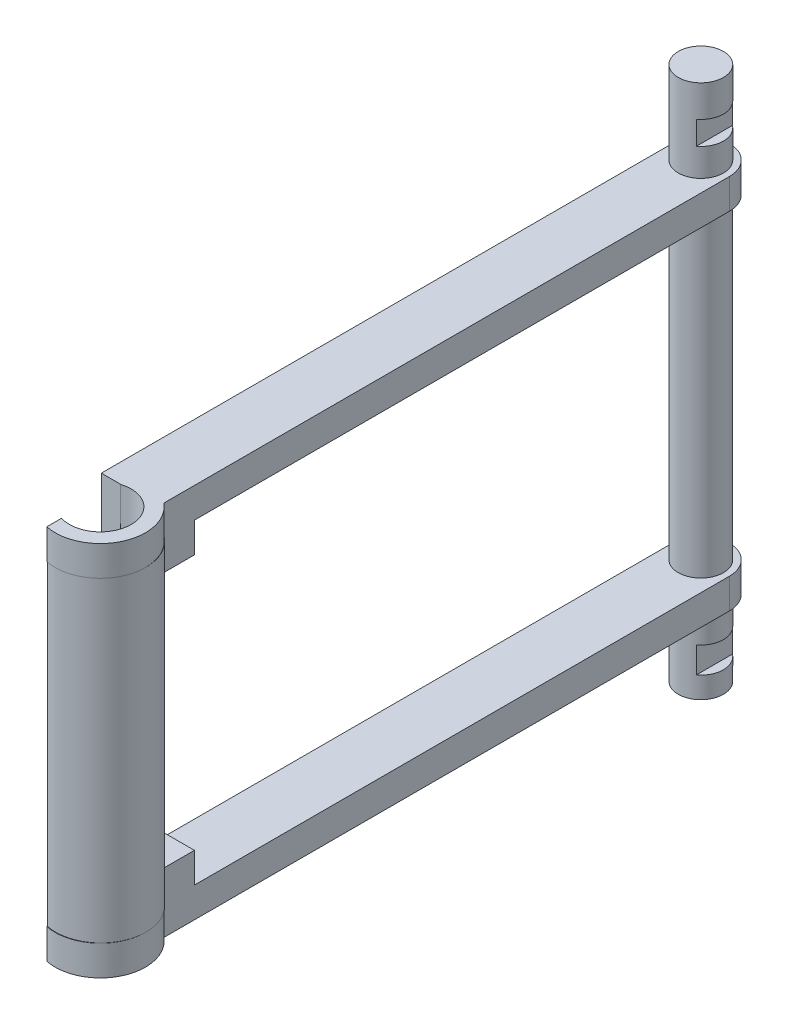
ISO-10303-21;
HEADER;
FILE_DESCRIPTION(('STEP AP214'),'2;1');
FILE_NAME('part.step','',(''),(''),'','','');
FILE_SCHEMA(('AUTOMOTIVE_DESIGN { 1 0 10303 214 1 1 1 1 }'));
ENDSEC;
DATA;
#1=APPLICATION_CONTEXT('core data for automotive mechanical design processes');
#2=APPLICATION_PROTOCOL_DEFINITION('international standard','automotive_design',2000,#1);
#3=PRODUCT_CONTEXT('',#1,'mechanical');
#4=PRODUCT('Part','Part','',(#3));
#5=PRODUCT_RELATED_PRODUCT_CATEGORY('part','',(#4));
#6=PRODUCT_DEFINITION_FORMATION('','',#4);
#7=PRODUCT_DEFINITION_CONTEXT('part definition',#1,'design');
#8=PRODUCT_DEFINITION('design','',#6,#7);
#9=PRODUCT_DEFINITION_SHAPE('','',#8);
#10=(LENGTH_UNIT() NAMED_UNIT(*) SI_UNIT(.MILLI.,.METRE.));
#11=(NAMED_UNIT(*) PLANE_ANGLE_UNIT() SI_UNIT($,.RADIAN.));
#12=(NAMED_UNIT(*) SI_UNIT($,.STERADIAN.) SOLID_ANGLE_UNIT());
#13=UNCERTAINTY_MEASURE_WITH_UNIT(LENGTH_MEASURE(1.E-05),#10,'distance_accuracy_value','');
#14=(GEOMETRIC_REPRESENTATION_CONTEXT(3) GLOBAL_UNCERTAINTY_ASSIGNED_CONTEXT((#13)) GLOBAL_UNIT_ASSIGNED_CONTEXT((#10,
#11,#12)) REPRESENTATION_CONTEXT('',''));
#15=CARTESIAN_POINT('',(0.,0.,0.));
#16=DIRECTION('',(0.,0.,1.));
#17=DIRECTION('',(1.,0.,0.));
#18=AXIS2_PLACEMENT_3D('',#15,#16,#17);
#19=CARTESIAN_POINT('',(0.,30.5,0.));
#20=DIRECTION('',(0.,-1.,0.));
#21=DIRECTION('',(0.,0.,-1.));
#22=AXIS2_PLACEMENT_3D('',#19,#20,#21);
#23=CYLINDRICAL_SURFACE('',#22,1.5);
#24=CARTESIAN_POINT('',(0.,30.5,0.));
#25=DIRECTION('',(0.,1.,0.));
#26=DIRECTION('',(0.,0.,1.));
#27=AXIS2_PLACEMENT_3D('',#24,#25,#26);
#28=CIRCLE('',#27,1.5);
#29=CARTESIAN_POINT('',(0.,30.5,1.5));
#30=VERTEX_POINT('',#29);
#31=EDGE_CURVE('E254',#30,#30,#28,.T.);
#32=ORIENTED_EDGE('',*,*,#31,.F.);
#33=EDGE_LOOP('',(#32));
#34=FACE_BOUND('',#33,.T.);
#35=CARTESIAN_POINT('',(0.,25.,0.));
#36=DIRECTION('',(0.,1.,0.));
#37=DIRECTION('',(0.,0.,1.));
#38=AXIS2_PLACEMENT_3D('',#35,#36,#37);
#39=CIRCLE('',#38,1.5);
#40=CARTESIAN_POINT('',(0.,25.,1.5));
#41=VERTEX_POINT('',#40);
#42=EDGE_CURVE('E258',#41,#41,#39,.F.);
#43=ORIENTED_EDGE('',*,*,#42,.F.);
#44=EDGE_LOOP('',(#43));
#45=FACE_BOUND('',#44,.T.);
#46=DIRECTION('',(0.,-1.,0.));
#47=VECTOR('',#46,1.);
#48=CARTESIAN_POINT('',(0.9,30.5,1.2));
#49=LINE('',#48,#47);
#50=CARTESIAN_POINT('',(0.9,28.3928639786026,1.2));
#51=VERTEX_POINT('',#50);
#52=CARTESIAN_POINT('',(0.9,26.8394891403858,1.2));
#53=VERTEX_POINT('',#52);
#54=EDGE_CURVE('E11',#51,#53,#49,.T.);
#55=ORIENTED_EDGE('',*,*,#54,.F.);
#56=CARTESIAN_POINT('',(0.,28.3928639786026,0.));
#57=DIRECTION('',(0.,1.,0.));
#58=DIRECTION('',(0.,0.,1.));
#59=AXIS2_PLACEMENT_3D('',#56,#57,#58);
#60=CIRCLE('',#59,1.5);
#61=CARTESIAN_POINT('',(0.9,28.3928639786026,-1.2));
#62=VERTEX_POINT('',#61);
#63=EDGE_CURVE('E238',#51,#62,#60,.T.);
#64=ORIENTED_EDGE('',*,*,#63,.T.);
#65=DIRECTION('',(0.,-1.,0.));
#66=VECTOR('',#65,1.);
#67=CARTESIAN_POINT('',(0.9,30.5,-1.2));
#68=LINE('',#67,#66);
#69=CARTESIAN_POINT('',(0.9,26.8394891403858,-1.2));
#70=VERTEX_POINT('',#69);
#71=EDGE_CURVE('E233',#70,#62,#68,.F.);
#72=ORIENTED_EDGE('',*,*,#71,.F.);
#73=CARTESIAN_POINT('',(0.,26.8394891403858,0.));
#74=DIRECTION('',(0.,-1.,0.));
#75=DIRECTION('',(0.,0.,-1.));
#76=AXIS2_PLACEMENT_3D('',#73,#74,#75);
#77=CIRCLE('',#76,1.5);
#78=EDGE_CURVE('E45',#70,#53,#77,.T.);
#79=ORIENTED_EDGE('',*,*,#78,.T.);
#80=EDGE_LOOP('',(#55,#64,#72,#79));
#81=FACE_BOUND('',#80,.T.);
#82=ADVANCED_FACE('F37',(#34,#45,#81),#23,.T.);
#83=CARTESIAN_POINT('',(0.,-5.,0.));
#84=DIRECTION('',(0.,1.,0.));
#85=DIRECTION('',(0.,0.,1.));
#86=AXIS2_PLACEMENT_3D('',#83,#84,#85);
#87=CYLINDRICAL_SURFACE('',#86,1.5);
#88=CARTESIAN_POINT('',(0.,0.,0.));
#89=DIRECTION('',(0.,1.,0.));
#90=DIRECTION('',(0.,0.,1.));
#91=AXIS2_PLACEMENT_3D('',#88,#89,#90);
#92=CIRCLE('',#91,1.5);
#93=CARTESIAN_POINT('',(0.,0.,1.5));
#94=VERTEX_POINT('',#93);
#95=EDGE_CURVE('E223',#94,#94,#92,.F.);
#96=ORIENTED_EDGE('',*,*,#95,.T.);
#97=EDGE_LOOP('',(#96));
#98=FACE_BOUND('',#97,.T.);
#99=CARTESIAN_POINT('',(0.,-5.,0.));
#100=DIRECTION('',(0.,-1.,0.));
#101=DIRECTION('',(0.,0.,-1.));
#102=AXIS2_PLACEMENT_3D('',#99,#100,#101);
#103=CIRCLE('',#102,1.5);
#104=CARTESIAN_POINT('',(0.,-5.,-1.5));
#105=VERTEX_POINT('',#104);
#106=EDGE_CURVE('E228',#105,#105,#103,.T.);
#107=ORIENTED_EDGE('',*,*,#106,.F.);
#108=EDGE_LOOP('',(#107));
#109=FACE_BOUND('',#108,.T.);
#110=DIRECTION('',(0.,1.,0.));
#111=VECTOR('',#110,1.);
#112=CARTESIAN_POINT('',(0.9,-5.,-1.2));
#113=LINE('',#112,#111);
#114=CARTESIAN_POINT('',(0.9,-3.58358721992147,-1.2));
#115=VERTEX_POINT('',#114);
#116=CARTESIAN_POINT('',(0.9,-1.85291950845112,-1.2));
#117=VERTEX_POINT('',#116);
#118=EDGE_CURVE('E231',#115,#117,#113,.T.);
#119=ORIENTED_EDGE('',*,*,#118,.F.);
#120=CARTESIAN_POINT('',(0.,-3.58358721992147,0.));
#121=DIRECTION('',(0.,-1.,0.));
#122=DIRECTION('',(0.,0.,-1.));
#123=AXIS2_PLACEMENT_3D('',#120,#121,#122);
#124=CIRCLE('',#123,1.5);
#125=CARTESIAN_POINT('',(0.9,-3.58358721992147,1.2));
#126=VERTEX_POINT('',#125);
#127=EDGE_CURVE('E227',#115,#126,#124,.T.);
#128=ORIENTED_EDGE('',*,*,#127,.T.);
#129=DIRECTION('',(0.,1.,0.));
#130=VECTOR('',#129,1.);
#131=CARTESIAN_POINT('',(0.9,-5.,1.2));
#132=LINE('',#131,#130);
#133=CARTESIAN_POINT('',(0.9,-1.85291950845112,1.2));
#134=VERTEX_POINT('',#133);
#135=EDGE_CURVE('E214',#134,#126,#132,.F.);
#136=ORIENTED_EDGE('',*,*,#135,.F.);
#137=CARTESIAN_POINT('',(0.,-1.85291950845112,0.));
#138=DIRECTION('',(0.,1.,0.));
#139=DIRECTION('',(0.,0.,1.));
#140=AXIS2_PLACEMENT_3D('',#137,#138,#139);
#141=CIRCLE('',#140,1.5);
#142=EDGE_CURVE('E222',#134,#117,#141,.T.);
#143=ORIENTED_EDGE('',*,*,#142,.T.);
#144=EDGE_LOOP('',(#119,#128,#136,#143));
#145=FACE_BOUND('',#144,.T.);
#146=ADVANCED_FACE('F230',(#98,#109,#145),#87,.T.);
#147=CARTESIAN_POINT('',(-1.9,21.,0.));
#148=DIRECTION('',(-1.,0.,0.));
#149=DIRECTION('',(0.,0.,1.));
#150=AXIS2_PLACEMENT_3D('',#147,#148,#149);
#151=PLANE('',#150);
#152=DIRECTION('',(0.,0.,1.));
#153=VECTOR('',#152,1.);
#154=CARTESIAN_POINT('',(-1.9,21.,0.));
#155=LINE('',#154,#153);
#156=CARTESIAN_POINT('',(-1.9,21.,35.5503543635308));
#157=VERTEX_POINT('',#156);
#158=CARTESIAN_POINT('',(-1.9,21.,37.9374599075044));
#159=VERTEX_POINT('',#158);
#160=EDGE_CURVE('E346',#157,#159,#155,.T.);
#161=ORIENTED_EDGE('',*,*,#160,.T.);
#162=DIRECTION('',(0.,1.,0.));
#163=VECTOR('',#162,1.);
#164=CARTESIAN_POINT('',(-1.9,25.,37.9374599075044));
#165=LINE('',#164,#163);
#166=CARTESIAN_POINT('',(-1.9,25.,37.9374599075044));
#167=VERTEX_POINT('',#166);
#168=EDGE_CURVE('E267',#159,#167,#165,.T.);
#169=ORIENTED_EDGE('',*,*,#168,.T.);
#170=DIRECTION('',(0.,0.,-1.));
#171=VECTOR('',#170,1.);
#172=CARTESIAN_POINT('',(-1.9,25.,37.9374599075044));
#173=LINE('',#172,#171);
#174=CARTESIAN_POINT('',(-1.9,25.,0.));
#175=VERTEX_POINT('',#174);
#176=EDGE_CURVE('E326',#167,#175,#173,.T.);
#177=ORIENTED_EDGE('',*,*,#176,.T.);
#178=DIRECTION('',(0.,1.,0.));
#179=VECTOR('',#178,1.);
#180=CARTESIAN_POINT('',(-1.9,23.,0.));
#181=LINE('',#180,#179);
#182=CARTESIAN_POINT('',(-1.9,23.,0.));
#183=VERTEX_POINT('',#182);
#184=EDGE_CURVE('E315',#183,#175,#181,.T.);
#185=ORIENTED_EDGE('',*,*,#184,.F.);
#186=DIRECTION('',(0.,0.,1.));
#187=VECTOR('',#186,1.);
#188=CARTESIAN_POINT('',(-1.9,23.,0.));
#189=LINE('',#188,#187);
#190=CARTESIAN_POINT('',(-1.9,23.,35.5503543635308));
#191=VERTEX_POINT('',#190);
#192=EDGE_CURVE('E312',#183,#191,#189,.T.);
#193=ORIENTED_EDGE('',*,*,#192,.T.);
#194=DIRECTION('',(0.,1.,0.));
#195=VECTOR('',#194,1.);
#196=CARTESIAN_POINT('',(-1.9,21.,35.5503543635308));
#197=LINE('',#196,#195);
#198=EDGE_CURVE('E348',#157,#191,#197,.T.);
#199=ORIENTED_EDGE('',*,*,#198,.F.);
#200=EDGE_LOOP('',(#161,#169,#177,#185,#193,#199));
#201=FACE_BOUND('',#200,.T.);
#202=ADVANCED_FACE('F537',(#201),#151,.T.);
#203=CARTESIAN_POINT('',(0.,25.,39.903679127832));
#204=DIRECTION('',(0.,1.,0.));
#205=DIRECTION('',(0.,0.,-1.));
#206=AXIS2_PLACEMENT_3D('',#203,#204,#205);
#207=PLANE('',#206);
#208=ORIENTED_EDGE('',*,*,#42,.T.);
#209=EDGE_LOOP('',(#208));
#210=FACE_BOUND('',#209,.T.);
#211=CARTESIAN_POINT('',(0.,25.,39.903679127832));
#212=DIRECTION('',(0.,-1.,0.));
#213=DIRECTION('',(0.,0.,-1.));
#214=AXIS2_PLACEMENT_3D('',#211,#212,#213);
#215=CIRCLE('',#214,2.05);
#216=CARTESIAN_POINT('',(-0.623316180081989,25.,37.9507385399881));
#217=VERTEX_POINT('',#216);
#218=CARTESIAN_POINT('',(-0.623316180081989,25.,41.8566197156759));
#219=VERTEX_POINT('',#218);
#220=EDGE_CURVE('E328',#217,#219,#215,.T.);
#221=ORIENTED_EDGE('',*,*,#220,.T.);
#222=DIRECTION('',(0.,0.,-1.));
#223=VECTOR('',#222,1.);
#224=CARTESIAN_POINT('',(-0.623316180081989,25.,36.9374599075044));
#225=LINE('',#224,#223);
#226=CARTESIAN_POINT('',(-0.623316180081989,25.,42.8382109371072));
#227=VERTEX_POINT('',#226);
#228=EDGE_CURVE('E278',#227,#219,#225,.T.);
#229=ORIENTED_EDGE('',*,*,#228,.F.);
#230=CARTESIAN_POINT('',(0.,25.,39.903679127832));
#231=DIRECTION('',(0.,-1.,0.));
#232=DIRECTION('',(0.,0.,-1.));
#233=AXIS2_PLACEMENT_3D('',#230,#231,#232);
#234=CIRCLE('',#233,3.);
#235=CARTESIAN_POINT('',(1.9,25.,37.5820417745832));
#236=VERTEX_POINT('',#235);
#237=EDGE_CURVE('E332',#236,#227,#234,.T.);
#238=ORIENTED_EDGE('',*,*,#237,.F.);
#239=DIRECTION('',(0.,0.,-1.));
#240=VECTOR('',#239,1.);
#241=CARTESIAN_POINT('',(1.9,25.,0.));
#242=LINE('',#241,#240);
#243=CARTESIAN_POINT('',(1.9,25.,0.));
#244=VERTEX_POINT('',#243);
#245=EDGE_CURVE('E309',#236,#244,#242,.T.);
#246=ORIENTED_EDGE('',*,*,#245,.T.);
#247=CARTESIAN_POINT('',(0.,25.,0.));
#248=DIRECTION('',(0.,1.,0.));
#249=DIRECTION('',(0.,0.,1.));
#250=AXIS2_PLACEMENT_3D('',#247,#248,#249);
#251=CIRCLE('',#250,1.9);
#252=EDGE_CURVE('E304',#244,#175,#251,.T.);
#253=ORIENTED_EDGE('',*,*,#252,.T.);
#254=ORIENTED_EDGE('',*,*,#176,.F.);
#255=DIRECTION('',(1.,0.,0.));
#256=VECTOR('',#255,1.);
#257=CARTESIAN_POINT('',(-0.623316180081989,25.,37.9374599075044));
#258=LINE('',#257,#256);
#259=CARTESIAN_POINT('',(-0.623316180081989,25.,37.9374599075044));
#260=VERTEX_POINT('',#259);
#261=EDGE_CURVE('E264',#167,#260,#258,.T.);
#262=ORIENTED_EDGE('',*,*,#261,.T.);
#263=EDGE_CURVE('E275',#217,#260,#225,.T.);
#264=ORIENTED_EDGE('',*,*,#263,.F.);
#265=EDGE_LOOP('',(#221,#229,#238,#246,#253,#254,#262,#264));
#266=FACE_BOUND('',#265,.T.);
#267=ADVANCED_FACE('F490',(#210,#266),#207,.T.);
#268=CARTESIAN_POINT('',(0.,12.5,39.8719917167796));
#269=DIRECTION('',(0.,-1.,0.));
#270=DIRECTION('',(0.,0.,-1.));
#271=AXIS2_PLACEMENT_3D('',#268,#269,#270);
#272=CYLINDRICAL_SURFACE('',#271,3.);
#273=CARTESIAN_POINT('',(0.,23.,39.8719917167796));
#274=DIRECTION('',(0.,1.,0.));
#275=DIRECTION('',(0.,0.,1.));
#276=AXIS2_PLACEMENT_3D('',#273,#274,#275);
#277=CIRCLE('',#276,3.);
#278=CARTESIAN_POINT('',(-0.623316180081989,23.,42.8065235260548));
#279=VERTEX_POINT('',#278);
#280=CARTESIAN_POINT('',(2.99995816254081,23.,39.8878354223058));
#281=VERTEX_POINT('',#280);
#282=EDGE_CURVE('E360',#279,#281,#277,.T.);
#283=ORIENTED_EDGE('',*,*,#282,.F.);
#284=DIRECTION('',(0.,-1.,0.));
#285=VECTOR('',#284,1.);
#286=CARTESIAN_POINT('',(-0.623316180081989,12.5,42.8065235260548));
#287=LINE('',#286,#285);
#288=CARTESIAN_POINT('',(-0.623316180081989,2.,42.8065235260548));
#289=VERTEX_POINT('',#288);
#290=EDGE_CURVE('E368',#279,#289,#287,.T.);
#291=ORIENTED_EDGE('',*,*,#290,.T.);
#292=CARTESIAN_POINT('',(0.,2.,39.8719917167796));
#293=DIRECTION('',(0.,-1.,0.));
#294=DIRECTION('',(0.,0.,-1.));
#295=AXIS2_PLACEMENT_3D('',#292,#293,#294);
#296=CIRCLE('',#295,3.);
#297=CARTESIAN_POINT('',(2.99995816254081,2.,39.8878354223058));
#298=VERTEX_POINT('',#297);
#299=EDGE_CURVE('E378',#298,#289,#296,.T.);
#300=ORIENTED_EDGE('',*,*,#299,.F.);
#301=CARTESIAN_POINT('',(0.,2.,39.8719917167796));
#302=DIRECTION('',(0.,1.,0.));
#303=DIRECTION('',(0.,0.,1.));
#304=AXIS2_PLACEMENT_3D('',#301,#302,#303);
#305=CIRCLE('',#304,3.);
#306=CARTESIAN_POINT('',(1.9,2.,37.5503543635308));
#307=VERTEX_POINT('',#306);
#308=EDGE_CURVE('E409',#298,#307,#305,.T.);
#309=ORIENTED_EDGE('',*,*,#308,.T.);
#310=DIRECTION('',(0.,-1.,0.));
#311=VECTOR('',#310,1.);
#312=CARTESIAN_POINT('',(1.9,4.,37.5503543635308));
#313=LINE('',#312,#311);
#314=CARTESIAN_POINT('',(1.9,4.,37.5503543635308));
#315=VERTEX_POINT('',#314);
#316=EDGE_CURVE('E401',#315,#307,#313,.T.);
#317=ORIENTED_EDGE('',*,*,#316,.F.);
#318=CARTESIAN_POINT('',(0.,4.,39.8719917167796));
#319=DIRECTION('',(0.,1.,0.));
#320=DIRECTION('',(0.,0.,1.));
#321=AXIS2_PLACEMENT_3D('',#318,#319,#320);
#322=CIRCLE('',#321,3.);
#323=CARTESIAN_POINT('',(-0.623316180081989,4.,36.9374599075044));
#324=VERTEX_POINT('',#323);
#325=EDGE_CURVE('E393',#324,#315,#322,.F.);
#326=ORIENTED_EDGE('',*,*,#325,.F.);
#327=DIRECTION('',(0.,1.,0.));
#328=VECTOR('',#327,1.);
#329=CARTESIAN_POINT('',(-0.623316180081989,0.,36.9374599075044));
#330=LINE('',#329,#328);
#331=CARTESIAN_POINT('',(-0.623316180081989,21.,36.9374599075044));
#332=VERTEX_POINT('',#331);
#333=EDGE_CURVE('E365',#324,#332,#330,.T.);
#334=ORIENTED_EDGE('',*,*,#333,.T.);
#335=CARTESIAN_POINT('',(0.,21.,39.8719917167796));
#336=DIRECTION('',(0.,1.,0.));
#337=DIRECTION('',(0.,0.,1.));
#338=AXIS2_PLACEMENT_3D('',#335,#336,#337);
#339=CIRCLE('',#338,3.);
#340=CARTESIAN_POINT('',(1.9,21.,37.5503543635308));
#341=VERTEX_POINT('',#340);
#342=EDGE_CURVE('E344',#332,#341,#339,.F.);
#343=ORIENTED_EDGE('',*,*,#342,.T.);
#344=DIRECTION('',(0.,1.,0.));
#345=VECTOR('',#344,1.);
#346=CARTESIAN_POINT('',(1.9,21.,37.5503543635308));
#347=LINE('',#346,#345);
#348=CARTESIAN_POINT('',(1.9,23.,37.5503543635308));
#349=VERTEX_POINT('',#348);
#350=EDGE_CURVE('E353',#341,#349,#347,.T.);
#351=ORIENTED_EDGE('',*,*,#350,.T.);
#352=EDGE_CURVE('E359',#281,#349,#277,.T.);
#353=ORIENTED_EDGE('',*,*,#352,.F.);
#354=EDGE_LOOP('',(#283,#291,#300,#309,#317,#326,#334,#343,#351,#353));
#355=FACE_BOUND('',#354,.T.);
#356=ADVANCED_FACE('F467',(#355),#272,.T.);
#357=CARTESIAN_POINT('',(0.,0.,39.903679127832));
#358=DIRECTION('',(0.,1.,0.));
#359=DIRECTION('',(0.,0.,1.));
#360=AXIS2_PLACEMENT_3D('',#357,#358,#359);
#361=CYLINDRICAL_SURFACE('',#360,2.05);
#362=DIRECTION('',(0.,1.,0.));
#363=VECTOR('',#362,1.);
#364=CARTESIAN_POINT('',(-0.623316180081989,0.,41.8566197156759));
#365=LINE('',#364,#363);
#366=CARTESIAN_POINT('',(-0.623316180081989,0.,41.8566197156759));
#367=VERTEX_POINT('',#366);
#368=EDGE_CURVE('E370',#367,#219,#365,.T.);
#369=ORIENTED_EDGE('',*,*,#368,.T.);
#370=ORIENTED_EDGE('',*,*,#220,.F.);
#371=DIRECTION('',(0.,1.,0.));
#372=VECTOR('',#371,1.);
#373=CARTESIAN_POINT('',(-0.623316180081989,0.,37.9507385399881));
#374=LINE('',#373,#372);
#375=CARTESIAN_POINT('',(-0.623316180081989,0.,37.9507385399881));
#376=VERTEX_POINT('',#375);
#377=EDGE_CURVE('E372',#217,#376,#374,.F.);
#378=ORIENTED_EDGE('',*,*,#377,.T.);
#379=CARTESIAN_POINT('',(0.,0.,39.903679127832));
#380=DIRECTION('',(0.,1.,0.));
#381=DIRECTION('',(0.,0.,1.));
#382=AXIS2_PLACEMENT_3D('',#379,#380,#381);
#383=CIRCLE('',#382,2.05);
#384=EDGE_CURVE('E406',#367,#376,#383,.T.);
#385=ORIENTED_EDGE('',*,*,#384,.F.);
#386=EDGE_LOOP('',(#369,#370,#378,#385));
#387=FACE_BOUND('',#386,.T.);
#388=ADVANCED_FACE('F495',(#387),#361,.F.);
#389=CARTESIAN_POINT('',(0.,21.,0.));
#390=DIRECTION('',(0.,-1.,0.));
#391=DIRECTION('',(0.,0.,1.));
#392=AXIS2_PLACEMENT_3D('',#389,#390,#391);
#393=PLANE('',#392);
#394=ORIENTED_EDGE('',*,*,#342,.F.);
#395=DIRECTION('',(0.,0.,-1.));
#396=VECTOR('',#395,1.);
#397=CARTESIAN_POINT('',(-0.623316180081989,21.,37.9374599075044));
#398=LINE('',#397,#396);
#399=CARTESIAN_POINT('',(-0.623316180081989,21.,37.9374599075044));
#400=VERTEX_POINT('',#399);
#401=EDGE_CURVE('E273',#400,#332,#398,.T.);
#402=ORIENTED_EDGE('',*,*,#401,.F.);
#403=DIRECTION('',(-1.,0.,0.));
#404=VECTOR('',#403,1.);
#405=CARTESIAN_POINT('',(-0.623316180081989,21.,37.9374599075044));
#406=LINE('',#405,#404);
#407=EDGE_CURVE('E270',#400,#159,#406,.T.);
#408=ORIENTED_EDGE('',*,*,#407,.T.);
#409=ORIENTED_EDGE('',*,*,#160,.F.);
#410=DIRECTION('',(1.,0.,0.));
#411=VECTOR('',#410,1.);
#412=CARTESIAN_POINT('',(0.,21.,35.5503543635308));
#413=LINE('',#412,#411);
#414=CARTESIAN_POINT('',(1.9,21.,35.5503543635308));
#415=VERTEX_POINT('',#414);
#416=EDGE_CURVE('E339',#157,#415,#413,.T.);
#417=ORIENTED_EDGE('',*,*,#416,.T.);
#418=DIRECTION('',(0.,0.,-1.));
#419=VECTOR('',#418,1.);
#420=CARTESIAN_POINT('',(1.9,21.,0.));
#421=LINE('',#420,#419);
#422=EDGE_CURVE('E341',#341,#415,#421,.T.);
#423=ORIENTED_EDGE('',*,*,#422,.F.);
#424=EDGE_LOOP('',(#394,#402,#408,#409,#417,#423));
#425=FACE_BOUND('',#424,.T.);
#426=ADVANCED_FACE('F563',(#425),#393,.T.);
#427=CARTESIAN_POINT('',(0.,23.,39.903679127832));
#428=DIRECTION('',(0.,1.,0.));
#429=DIRECTION('',(0.,0.,-1.));
#430=AXIS2_PLACEMENT_3D('',#427,#428,#429);
#431=PLANE('',#430);
#432=DIRECTION('',(0.,0.,1.));
#433=VECTOR('',#432,1.);
#434=CARTESIAN_POINT('',(-0.623316180081989,23.,39.903679127832));
#435=LINE('',#434,#433);
#436=CARTESIAN_POINT('',(-0.623316180081989,23.,42.8382109371072));
#437=VERTEX_POINT('',#436);
#438=EDGE_CURVE('E279',#279,#437,#435,.T.);
#439=ORIENTED_EDGE('',*,*,#438,.F.);
#440=ORIENTED_EDGE('',*,*,#282,.T.);
#441=CARTESIAN_POINT('',(0.,23.,39.903679127832));
#442=DIRECTION('',(0.,-1.,0.));
#443=DIRECTION('',(0.,0.,-1.));
#444=AXIS2_PLACEMENT_3D('',#441,#442,#443);
#445=CIRCLE('',#444,3.);
#446=EDGE_CURVE('E331',#281,#437,#445,.T.);
#447=ORIENTED_EDGE('',*,*,#446,.T.);
#448=EDGE_LOOP('',(#439,#440,#447));
#449=FACE_BOUND('',#448,.T.);
#450=ADVANCED_FACE('F472',(#449),#431,.F.);
#451=CARTESIAN_POINT('',(0.,25.,39.903679127832));
#452=DIRECTION('',(0.,-1.,0.));
#453=DIRECTION('',(0.,0.,-1.));
#454=AXIS2_PLACEMENT_3D('',#451,#452,#453);
#455=CYLINDRICAL_SURFACE('',#454,3.);
#456=ORIENTED_EDGE('',*,*,#237,.T.);
#457=DIRECTION('',(0.,-1.,0.));
#458=VECTOR('',#457,1.);
#459=CARTESIAN_POINT('',(-0.623316180081989,25.,42.8382109371072));
#460=LINE('',#459,#458);
#461=EDGE_CURVE('E434',#227,#437,#460,.T.);
#462=ORIENTED_EDGE('',*,*,#461,.T.);
#463=ORIENTED_EDGE('',*,*,#446,.F.);
#464=CARTESIAN_POINT('',(1.9,23.,37.5820417745832));
#465=VERTEX_POINT('',#464);
#466=EDGE_CURVE('E338',#465,#281,#445,.T.);
#467=ORIENTED_EDGE('',*,*,#466,.F.);
#468=DIRECTION('',(0.,-1.,0.));
#469=VECTOR('',#468,1.);
#470=CARTESIAN_POINT('',(1.9,25.,37.5820417745832));
#471=LINE('',#470,#469);
#472=EDGE_CURVE('E324',#236,#465,#471,.T.);
#473=ORIENTED_EDGE('',*,*,#472,.F.);
#474=EDGE_LOOP('',(#456,#462,#463,#467,#473));
#475=FACE_BOUND('',#474,.T.);
#476=ADVANCED_FACE('F477',(#475),#455,.T.);
#477=CARTESIAN_POINT('',(-0.623316180081989,0.,36.9374599075044));
#478=DIRECTION('',(1.,0.,0.));
#479=DIRECTION('',(0.,0.,-1.));
#480=AXIS2_PLACEMENT_3D('',#477,#478,#479);
#481=PLANE('',#480);
#482=DIRECTION('',(0.,-1.,0.));
#483=VECTOR('',#482,1.);
#484=CARTESIAN_POINT('',(-0.623316180081989,25.,37.9374599075044));
#485=LINE('',#484,#483);
#486=EDGE_CURVE('E261',#260,#400,#485,.T.);
#487=ORIENTED_EDGE('',*,*,#486,.T.);
#488=ORIENTED_EDGE('',*,*,#401,.T.);
#489=ORIENTED_EDGE('',*,*,#333,.F.);
#490=DIRECTION('',(0.,0.,-1.));
#491=VECTOR('',#490,1.);
#492=CARTESIAN_POINT('',(-0.623316180081989,4.,37.9374599075044));
#493=LINE('',#492,#491);
#494=CARTESIAN_POINT('',(-0.623316180081989,4.,37.9374599075044));
#495=VERTEX_POINT('',#494);
#496=EDGE_CURVE('E292',#495,#324,#493,.T.);
#497=ORIENTED_EDGE('',*,*,#496,.F.);
#498=DIRECTION('',(0.,1.,0.));
#499=VECTOR('',#498,1.);
#500=CARTESIAN_POINT('',(-0.623316180081989,0.,37.9374599075044));
#501=LINE('',#500,#499);
#502=CARTESIAN_POINT('',(-0.623316180081989,0.,37.9374599075044));
#503=VERTEX_POINT('',#502);
#504=EDGE_CURVE('E281',#503,#495,#501,.T.);
#505=ORIENTED_EDGE('',*,*,#504,.F.);
#506=DIRECTION('',(0.,0.,-1.));
#507=VECTOR('',#506,1.);
#508=CARTESIAN_POINT('',(-0.623316180081989,0.,36.9374599075044));
#509=LINE('',#508,#507);
#510=EDGE_CURVE('E294',#376,#503,#509,.T.);
#511=ORIENTED_EDGE('',*,*,#510,.F.);
#512=ORIENTED_EDGE('',*,*,#377,.F.);
#513=ORIENTED_EDGE('',*,*,#263,.T.);
#514=EDGE_LOOP('',(#487,#488,#489,#497,#505,#511,#512,#513));
#515=FACE_BOUND('',#514,.T.);
#516=ADVANCED_FACE('F500',(#515),#481,.F.);
#517=CARTESIAN_POINT('',(-1.9,2.,0.));
#518=DIRECTION('',(1.,0.,0.));
#519=DIRECTION('',(0.,0.,-1.));
#520=AXIS2_PLACEMENT_3D('',#517,#518,#519);
#521=PLANE('',#520);
#522=DIRECTION('',(0.,0.,1.));
#523=VECTOR('',#522,1.);
#524=CARTESIAN_POINT('',(-1.9,0.,0.));
#525=LINE('',#524,#523);
#526=CARTESIAN_POINT('',(-1.9,0.,0.));
#527=VERTEX_POINT('',#526);
#528=CARTESIAN_POINT('',(-1.9,0.,37.9374599075044));
#529=VERTEX_POINT('',#528);
#530=EDGE_CURVE('E426',#527,#529,#525,.T.);
#531=ORIENTED_EDGE('',*,*,#530,.T.);
#532=DIRECTION('',(0.,-1.,0.));
#533=VECTOR('',#532,1.);
#534=CARTESIAN_POINT('',(-1.9,0.,37.9374599075044));
#535=LINE('',#534,#533);
#536=CARTESIAN_POINT('',(-1.9,4.,37.9374599075044));
#537=VERTEX_POINT('',#536);
#538=EDGE_CURVE('E287',#537,#529,#535,.T.);
#539=ORIENTED_EDGE('',*,*,#538,.F.);
#540=DIRECTION('',(0.,0.,1.));
#541=VECTOR('',#540,1.);
#542=CARTESIAN_POINT('',(-1.9,4.,0.));
#543=LINE('',#542,#541);
#544=CARTESIAN_POINT('',(-1.9,4.,35.5503543635308));
#545=VERTEX_POINT('',#544);
#546=EDGE_CURVE('E391',#545,#537,#543,.T.);
#547=ORIENTED_EDGE('',*,*,#546,.F.);
#548=DIRECTION('',(0.,-1.,0.));
#549=VECTOR('',#548,1.);
#550=CARTESIAN_POINT('',(-1.9,4.,35.5503543635308));
#551=LINE('',#550,#549);
#552=CARTESIAN_POINT('',(-1.9,2.,35.5503543635308));
#553=VERTEX_POINT('',#552);
#554=EDGE_CURVE('E404',#545,#553,#551,.T.);
#555=ORIENTED_EDGE('',*,*,#554,.T.);
#556=DIRECTION('',(0.,0.,1.));
#557=VECTOR('',#556,1.);
#558=CARTESIAN_POINT('',(-1.9,2.,0.));
#559=LINE('',#558,#557);
#560=CARTESIAN_POINT('',(-1.9,2.,0.));
#561=VERTEX_POINT('',#560);
#562=EDGE_CURVE('E415',#561,#553,#559,.T.);
#563=ORIENTED_EDGE('',*,*,#562,.F.);
#564=DIRECTION('',(0.,-1.,0.));
#565=VECTOR('',#564,1.);
#566=CARTESIAN_POINT('',(-1.9,2.,0.));
#567=LINE('',#566,#565);
#568=EDGE_CURVE('E431',#561,#527,#567,.T.);
#569=ORIENTED_EDGE('',*,*,#568,.T.);
#570=EDGE_LOOP('',(#531,#539,#547,#555,#563,#569));
#571=FACE_BOUND('',#570,.T.);
#572=ADVANCED_FACE('F508',(#571),#521,.F.);
#573=CARTESIAN_POINT('',(0.,4.,0.));
#574=DIRECTION('',(0.,1.,0.));
#575=DIRECTION('',(0.,0.,1.));
#576=AXIS2_PLACEMENT_3D('',#573,#574,#575);
#577=PLANE('',#576);
#578=ORIENTED_EDGE('',*,*,#546,.T.);
#579=DIRECTION('',(-1.,0.,0.));
#580=VECTOR('',#579,1.);
#581=CARTESIAN_POINT('',(-0.623316180081989,4.,37.9374599075044));
#582=LINE('',#581,#580);
#583=EDGE_CURVE('E284',#495,#537,#582,.T.);
#584=ORIENTED_EDGE('',*,*,#583,.F.);
#585=ORIENTED_EDGE('',*,*,#496,.T.);
#586=ORIENTED_EDGE('',*,*,#325,.T.);
#587=DIRECTION('',(0.,0.,-1.));
#588=VECTOR('',#587,1.);
#589=CARTESIAN_POINT('',(1.9,4.,0.));
#590=LINE('',#589,#588);
#591=CARTESIAN_POINT('',(1.9,4.,35.5503543635308));
#592=VERTEX_POINT('',#591);
#593=EDGE_CURVE('E395',#315,#592,#590,.T.);
#594=ORIENTED_EDGE('',*,*,#593,.T.);
#595=DIRECTION('',(1.,0.,0.));
#596=VECTOR('',#595,1.);
#597=CARTESIAN_POINT('',(0.,4.,35.5503543635308));
#598=LINE('',#597,#596);
#599=EDGE_CURVE('E388',#545,#592,#598,.T.);
#600=ORIENTED_EDGE('',*,*,#599,.F.);
#601=EDGE_LOOP('',(#578,#584,#585,#586,#594,#600));
#602=FACE_BOUND('',#601,.T.);
#603=ADVANCED_FACE('F581',(#602),#577,.T.);
#604=CARTESIAN_POINT('',(0.,23.,39.8719917167796));
#605=DIRECTION('',(0.,-1.,0.));
#606=DIRECTION('',(0.,0.,1.));
#607=AXIS2_PLACEMENT_3D('',#604,#605,#606);
#608=PLANE('',#607);
#609=ORIENTED_EDGE('',*,*,#352,.T.);
#610=DIRECTION('',(0.,0.,-1.));
#611=VECTOR('',#610,1.);
#612=CARTESIAN_POINT('',(1.9,23.,0.));
#613=LINE('',#612,#611);
#614=EDGE_CURVE('E311',#465,#349,#613,.T.);
#615=ORIENTED_EDGE('',*,*,#614,.F.);
#616=ORIENTED_EDGE('',*,*,#466,.T.);
#617=EDGE_LOOP('',(#609,#615,#616));
#618=FACE_BOUND('',#617,.T.);
#619=ADVANCED_FACE('F483',(#618),#608,.F.);
#620=CARTESIAN_POINT('',(1.9,2.,0.));
#621=DIRECTION('',(-1.,0.,0.));
#622=DIRECTION('',(0.,0.,1.));
#623=AXIS2_PLACEMENT_3D('',#620,#621,#622);
#624=PLANE('',#623);
#625=ORIENTED_EDGE('',*,*,#316,.T.);
#626=DIRECTION('',(0.,0.,-1.));
#627=VECTOR('',#626,1.);
#628=CARTESIAN_POINT('',(1.9,2.,0.));
#629=LINE('',#628,#627);
#630=CARTESIAN_POINT('',(1.9,2.,37.5820417745832));
#631=VERTEX_POINT('',#630);
#632=EDGE_CURVE('E420',#631,#307,#629,.T.);
#633=ORIENTED_EDGE('',*,*,#632,.F.);
#634=DIRECTION('',(0.,1.,0.));
#635=VECTOR('',#634,1.);
#636=CARTESIAN_POINT('',(1.9,0.,37.5820417745832));
#637=LINE('',#636,#635);
#638=CARTESIAN_POINT('',(1.9,0.,37.5820417745832));
#639=VERTEX_POINT('',#638);
#640=EDGE_CURVE('E384',#639,#631,#637,.T.);
#641=ORIENTED_EDGE('',*,*,#640,.F.);
#642=DIRECTION('',(0.,0.,-1.));
#643=VECTOR('',#642,1.);
#644=CARTESIAN_POINT('',(1.9,0.,0.));
#645=LINE('',#644,#643);
#646=CARTESIAN_POINT('',(1.9,0.,0.));
#647=VERTEX_POINT('',#646);
#648=EDGE_CURVE('E416',#639,#647,#645,.T.);
#649=ORIENTED_EDGE('',*,*,#648,.T.);
#650=DIRECTION('',(0.,-1.,0.));
#651=VECTOR('',#650,1.);
#652=CARTESIAN_POINT('',(1.9,2.,0.));
#653=LINE('',#652,#651);
#654=CARTESIAN_POINT('',(1.9,2.,0.));
#655=VERTEX_POINT('',#654);
#656=EDGE_CURVE('E423',#655,#647,#653,.T.);
#657=ORIENTED_EDGE('',*,*,#656,.F.);
#658=CARTESIAN_POINT('',(1.9,2.,35.5503543635308));
#659=VERTEX_POINT('',#658);
#660=EDGE_CURVE('E419',#659,#655,#629,.T.);
#661=ORIENTED_EDGE('',*,*,#660,.F.);
#662=DIRECTION('',(0.,-1.,0.));
#663=VECTOR('',#662,1.);
#664=CARTESIAN_POINT('',(1.9,4.,35.5503543635308));
#665=LINE('',#664,#663);
#666=EDGE_CURVE('E397',#592,#659,#665,.T.);
#667=ORIENTED_EDGE('',*,*,#666,.F.);
#668=ORIENTED_EDGE('',*,*,#593,.F.);
#669=EDGE_LOOP('',(#625,#633,#641,#649,#657,#661,#667,#668));
#670=FACE_BOUND('',#669,.T.);
#671=ADVANCED_FACE('F516',(#670),#624,.F.);
#672=CARTESIAN_POINT('',(0.,2.,39.8719917167796));
#673=DIRECTION('',(0.,1.,0.));
#674=DIRECTION('',(0.,0.,1.));
#675=AXIS2_PLACEMENT_3D('',#672,#673,#674);
#676=PLANE('',#675);
#677=CARTESIAN_POINT('',(0.,2.,39.903679127832));
#678=DIRECTION('',(0.,-1.,0.));
#679=DIRECTION('',(0.,0.,-1.));
#680=AXIS2_PLACEMENT_3D('',#677,#678,#679);
#681=CIRCLE('',#680,3.);
#682=EDGE_CURVE('E379',#631,#298,#681,.T.);
#683=ORIENTED_EDGE('',*,*,#682,.F.);
#684=ORIENTED_EDGE('',*,*,#632,.T.);
#685=ORIENTED_EDGE('',*,*,#308,.F.);
#686=EDGE_LOOP('',(#683,#684,#685));
#687=FACE_BOUND('',#686,.T.);
#688=ADVANCED_FACE('F521',(#687),#676,.F.);
#689=CARTESIAN_POINT('',(0.,2.,0.));
#690=DIRECTION('',(0.,-1.,0.));
#691=DIRECTION('',(0.,0.,-1.));
#692=AXIS2_PLACEMENT_3D('',#689,#690,#691);
#693=CYLINDRICAL_SURFACE('',#692,1.9);
#694=CARTESIAN_POINT('',(0.,0.,0.));
#695=DIRECTION('',(0.,1.,0.));
#696=DIRECTION('',(0.,0.,1.));
#697=AXIS2_PLACEMENT_3D('',#694,#695,#696);
#698=CIRCLE('',#697,1.9);
#699=EDGE_CURVE('E411',#647,#527,#698,.T.);
#700=ORIENTED_EDGE('',*,*,#699,.T.);
#701=ORIENTED_EDGE('',*,*,#568,.F.);
#702=CARTESIAN_POINT('',(0.,2.,0.));
#703=DIRECTION('',(0.,1.,0.));
#704=DIRECTION('',(0.,0.,1.));
#705=AXIS2_PLACEMENT_3D('',#702,#703,#704);
#706=CIRCLE('',#705,1.9);
#707=EDGE_CURVE('E412',#655,#561,#706,.T.);
#708=ORIENTED_EDGE('',*,*,#707,.F.);
#709=ORIENTED_EDGE('',*,*,#656,.T.);
#710=EDGE_LOOP('',(#700,#701,#708,#709));
#711=FACE_BOUND('',#710,.T.);
#712=ADVANCED_FACE('F39',(#711),#693,.T.);
#713=CARTESIAN_POINT('',(0.,2.,0.));
#714=DIRECTION('',(0.,1.,0.));
#715=DIRECTION('',(0.,0.,1.));
#716=AXIS2_PLACEMENT_3D('',#713,#714,#715);
#717=PLANE('',#716);
#718=CARTESIAN_POINT('',(0.,2.,0.));
#719=DIRECTION('',(0.,1.,0.));
#720=DIRECTION('',(0.,0.,1.));
#721=AXIS2_PLACEMENT_3D('',#718,#719,#720);
#722=CIRCLE('',#721,1.5);
#723=CARTESIAN_POINT('',(0.,2.,-1.5));
#724=VERTEX_POINT('',#723);
#725=EDGE_CURVE('E362',#724,#724,#722,.T.);
#726=ORIENTED_EDGE('',*,*,#725,.F.);
#727=EDGE_LOOP('',(#726));
#728=FACE_BOUND('',#727,.T.);
#729=DIRECTION('',(1.,0.,0.));
#730=VECTOR('',#729,1.);
#731=CARTESIAN_POINT('',(0.,2.,35.5503543635308));
#732=LINE('',#731,#730);
#733=EDGE_CURVE('E387',#553,#659,#732,.T.);
#734=ORIENTED_EDGE('',*,*,#733,.T.);
#735=ORIENTED_EDGE('',*,*,#660,.T.);
#736=ORIENTED_EDGE('',*,*,#707,.T.);
#737=ORIENTED_EDGE('',*,*,#562,.T.);
#738=EDGE_LOOP('',(#734,#735,#736,#737));
#739=FACE_BOUND('',#738,.T.);
#740=ADVANCED_FACE('F448',(#728,#739),#717,.T.);
#741=CARTESIAN_POINT('',(0.,0.,0.));
#742=DIRECTION('',(0.,1.,0.));
#743=DIRECTION('',(0.,0.,1.));
#744=AXIS2_PLACEMENT_3D('',#741,#742,#743);
#745=PLANE('',#744);
#746=ORIENTED_EDGE('',*,*,#95,.F.);
#747=EDGE_LOOP('',(#746));
#748=FACE_BOUND('',#747,.T.);
#749=CARTESIAN_POINT('',(0.,0.,39.903679127832));
#750=DIRECTION('',(0.,-1.,0.));
#751=DIRECTION('',(0.,0.,-1.));
#752=AXIS2_PLACEMENT_3D('',#749,#750,#751);
#753=CIRCLE('',#752,3.);
#754=CARTESIAN_POINT('',(-0.623316180081989,0.,42.8382109371072));
#755=VERTEX_POINT('',#754);
#756=EDGE_CURVE('E375',#639,#755,#753,.T.);
#757=ORIENTED_EDGE('',*,*,#756,.T.);
#758=EDGE_CURVE('E297',#755,#367,#509,.T.);
#759=ORIENTED_EDGE('',*,*,#758,.T.);
#760=ORIENTED_EDGE('',*,*,#384,.T.);
#761=ORIENTED_EDGE('',*,*,#510,.T.);
#762=DIRECTION('',(1.,0.,0.));
#763=VECTOR('',#762,1.);
#764=CARTESIAN_POINT('',(-0.623316180081989,0.,37.9374599075044));
#765=LINE('',#764,#763);
#766=EDGE_CURVE('E290',#529,#503,#765,.T.);
#767=ORIENTED_EDGE('',*,*,#766,.F.);
#768=ORIENTED_EDGE('',*,*,#530,.F.);
#769=ORIENTED_EDGE('',*,*,#699,.F.);
#770=ORIENTED_EDGE('',*,*,#648,.F.);
#771=EDGE_LOOP('',(#757,#759,#760,#761,#767,#768,#769,#770));
#772=FACE_BOUND('',#771,.T.);
#773=ADVANCED_FACE('F444',(#748,#772),#745,.F.);
#774=CARTESIAN_POINT('',(0.,4.,35.5503543635308));
#775=DIRECTION('',(0.,0.,-1.));
#776=DIRECTION('',(-1.,0.,0.));
#777=AXIS2_PLACEMENT_3D('',#774,#775,#776);
#778=PLANE('',#777);
#779=ORIENTED_EDGE('',*,*,#733,.F.);
#780=ORIENTED_EDGE('',*,*,#554,.F.);
#781=ORIENTED_EDGE('',*,*,#599,.T.);
#782=ORIENTED_EDGE('',*,*,#666,.T.);
#783=EDGE_LOOP('',(#779,#780,#781,#782));
#784=FACE_BOUND('',#783,.T.);
#785=ADVANCED_FACE('F447',(#784),#778,.T.);
#786=CARTESIAN_POINT('',(0.,0.,39.903679127832));
#787=DIRECTION('',(0.,1.,0.));
#788=DIRECTION('',(0.,0.,1.));
#789=AXIS2_PLACEMENT_3D('',#786,#787,#788);
#790=CYLINDRICAL_SURFACE('',#789,3.);
#791=CARTESIAN_POINT('',(-0.623316180081989,2.,42.8382109371072));
#792=VERTEX_POINT('',#791);
#793=EDGE_CURVE('E374',#298,#792,#681,.T.);
#794=ORIENTED_EDGE('',*,*,#793,.T.);
#795=DIRECTION('',(0.,1.,0.));
#796=VECTOR('',#795,1.);
#797=CARTESIAN_POINT('',(-0.623316180081989,0.,42.8382109371072));
#798=LINE('',#797,#796);
#799=EDGE_CURVE('E301',#792,#755,#798,.F.);
#800=ORIENTED_EDGE('',*,*,#799,.T.);
#801=ORIENTED_EDGE('',*,*,#756,.F.);
#802=ORIENTED_EDGE('',*,*,#640,.T.);
#803=ORIENTED_EDGE('',*,*,#682,.T.);
#804=EDGE_LOOP('',(#794,#800,#801,#802,#803));
#805=FACE_BOUND('',#804,.T.);
#806=ADVANCED_FACE('F457',(#805),#790,.T.);
#807=CARTESIAN_POINT('',(0.,2.,39.903679127832));
#808=DIRECTION('',(0.,-1.,0.));
#809=DIRECTION('',(0.,0.,-1.));
#810=AXIS2_PLACEMENT_3D('',#807,#808,#809);
#811=PLANE('',#810);
#812=ORIENTED_EDGE('',*,*,#299,.T.);
#813=DIRECTION('',(0.,0.,1.));
#814=VECTOR('',#813,1.);
#815=CARTESIAN_POINT('',(-0.623316180081989,2.,39.903679127832));
#816=LINE('',#815,#814);
#817=EDGE_CURVE('E298',#289,#792,#816,.T.);
#818=ORIENTED_EDGE('',*,*,#817,.T.);
#819=ORIENTED_EDGE('',*,*,#793,.F.);
#820=EDGE_LOOP('',(#812,#818,#819));
#821=FACE_BOUND('',#820,.T.);
#822=ADVANCED_FACE('F463',(#821),#811,.F.);
#823=ORIENTED_EDGE('',*,*,#290,.F.);
#824=ORIENTED_EDGE('',*,*,#438,.T.);
#825=ORIENTED_EDGE('',*,*,#461,.F.);
#826=ORIENTED_EDGE('',*,*,#228,.T.);
#827=ORIENTED_EDGE('',*,*,#368,.F.);
#828=ORIENTED_EDGE('',*,*,#758,.F.);
#829=ORIENTED_EDGE('',*,*,#799,.F.);
#830=ORIENTED_EDGE('',*,*,#817,.F.);
#831=EDGE_LOOP('',(#823,#824,#825,#826,#827,#828,#829,#830));
#832=FACE_BOUND('',#831,.T.);
#833=ADVANCED_FACE('F461',(#832),#481,.F.);
#834=CARTESIAN_POINT('',(0.,12.5,0.));
#835=DIRECTION('',(0.,-1.,0.));
#836=DIRECTION('',(0.,0.,-1.));
#837=AXIS2_PLACEMENT_3D('',#834,#835,#836);
#838=CYLINDRICAL_SURFACE('',#837,1.5);
#839=CARTESIAN_POINT('',(0.,23.,0.));
#840=DIRECTION('',(0.,-1.,0.));
#841=DIRECTION('',(0.,0.,-1.));
#842=AXIS2_PLACEMENT_3D('',#839,#840,#841);
#843=CIRCLE('',#842,1.5);
#844=CARTESIAN_POINT('',(0.,23.,-1.5));
#845=VERTEX_POINT('',#844);
#846=EDGE_CURVE('E257',#845,#845,#843,.F.);
#847=CARTESIAN_POINT('',(0.,2.,-1.5));
#848=CARTESIAN_POINT('',(0.,2.21875,-1.5));
#849=CARTESIAN_POINT('',(0.,2.4375,-1.5));
#850=CARTESIAN_POINT('',(0.,2.875,-1.5));
#851=CARTESIAN_POINT('',(0.,3.09375,-1.5));
#852=CARTESIAN_POINT('',(0.,3.53125,-1.5));
#853=CARTESIAN_POINT('',(0.,3.75,-1.5));
#854=CARTESIAN_POINT('',(0.,4.1875,-1.5));
#855=CARTESIAN_POINT('',(0.,4.40625,-1.5));
#856=CARTESIAN_POINT('',(0.,4.84375,-1.5));
#857=CARTESIAN_POINT('',(0.,5.0625,-1.5));
#858=CARTESIAN_POINT('',(0.,5.5,-1.5));
#859=CARTESIAN_POINT('',(0.,5.71875,-1.5));
#860=CARTESIAN_POINT('',(0.,6.15625,-1.5));
#861=CARTESIAN_POINT('',(0.,6.375,-1.5));
#862=CARTESIAN_POINT('',(0.,6.8125,-1.5));
#863=CARTESIAN_POINT('',(0.,7.03125,-1.5));
#864=CARTESIAN_POINT('',(0.,7.46875,-1.5));
#865=CARTESIAN_POINT('',(0.,7.6875,-1.5));
#866=CARTESIAN_POINT('',(0.,8.125,-1.5));
#867=CARTESIAN_POINT('',(0.,8.34375,-1.5));
#868=CARTESIAN_POINT('',(0.,8.78125,-1.5));
#869=CARTESIAN_POINT('',(0.,9.,-1.5));
#870=CARTESIAN_POINT('',(0.,9.4375,-1.5));
#871=CARTESIAN_POINT('',(0.,9.65625,-1.5));
#872=CARTESIAN_POINT('',(0.,10.09375,-1.5));
#873=CARTESIAN_POINT('',(0.,10.3125,-1.5));
#874=CARTESIAN_POINT('',(0.,10.75,-1.5));
#875=CARTESIAN_POINT('',(0.,10.96875,-1.5));
#876=CARTESIAN_POINT('',(0.,11.40625,-1.5));
#877=CARTESIAN_POINT('',(0.,11.625,-1.5));
#878=CARTESIAN_POINT('',(0.,12.0625,-1.5));
#879=CARTESIAN_POINT('',(0.,12.28125,-1.5));
#880=CARTESIAN_POINT('',(0.,12.71875,-1.5));
#881=CARTESIAN_POINT('',(0.,12.9375,-1.5));
#882=CARTESIAN_POINT('',(0.,13.375,-1.5));
#883=CARTESIAN_POINT('',(0.,13.59375,-1.5));
#884=CARTESIAN_POINT('',(0.,14.03125,-1.5));
#885=CARTESIAN_POINT('',(0.,14.25,-1.5));
#886=CARTESIAN_POINT('',(0.,14.6875,-1.5));
#887=CARTESIAN_POINT('',(0.,14.90625,-1.5));
#888=CARTESIAN_POINT('',(0.,15.34375,-1.5));
#889=CARTESIAN_POINT('',(0.,15.5625,-1.5));
#890=CARTESIAN_POINT('',(0.,16.,-1.5));
#891=CARTESIAN_POINT('',(0.,16.21875,-1.5));
#892=CARTESIAN_POINT('',(0.,16.65625,-1.5));
#893=CARTESIAN_POINT('',(0.,16.875,-1.5));
#894=CARTESIAN_POINT('',(0.,17.3125,-1.5));
#895=CARTESIAN_POINT('',(0.,17.53125,-1.5));
#896=CARTESIAN_POINT('',(0.,17.96875,-1.5));
#897=CARTESIAN_POINT('',(0.,18.1875,-1.5));
#898=CARTESIAN_POINT('',(0.,18.625,-1.5));
#899=CARTESIAN_POINT('',(0.,18.84375,-1.5));
#900=CARTESIAN_POINT('',(0.,19.28125,-1.5));
#901=CARTESIAN_POINT('',(0.,19.5,-1.5));
#902=CARTESIAN_POINT('',(0.,19.9375,-1.5));
#903=CARTESIAN_POINT('',(0.,20.15625,-1.5));
#904=CARTESIAN_POINT('',(0.,20.59375,-1.5));
#905=CARTESIAN_POINT('',(0.,20.8125,-1.5));
#906=CARTESIAN_POINT('',(0.,21.25,-1.5));
#907=CARTESIAN_POINT('',(0.,21.46875,-1.5));
#908=CARTESIAN_POINT('',(0.,21.90625,-1.5));
#909=CARTESIAN_POINT('',(0.,22.125,-1.5));
#910=CARTESIAN_POINT('',(0.,22.5625,-1.5));
#911=CARTESIAN_POINT('',(0.,22.78125,-1.5));
#912=CARTESIAN_POINT('',(0.,23.,-1.5));
#913=B_SPLINE_CURVE_WITH_KNOTS('',3,(#847,#848,#849,#850,#851,#852,#853,#854,#855,#856,#857,
#858,#859,#860,#861,#862,#863,#864,#865,#866,#867,#868,#869,#870,#871,#872,#873,#874,#875,#876,
#877,#878,#879,#880,#881,#882,#883,#884,#885,#886,#887,#888,#889,#890,#891,#892,#893,#894,#895,
#896,#897,#898,#899,#900,#901,#902,#903,#904,#905,#906,#907,#908,#909,#910,#911,#912),
.UNSPECIFIED.,.F.,.F.,(4,2,2,2,2,2,2,2,2,2,2,2,2,2,2,2,2,2,2,2,2,2,2,2,2,2,2,2,2,2,2,2,4),(0.,
0.656250000000001,1.3125,1.96875,2.625,3.28125,3.9375,4.59375,5.25,5.90625,6.5625,7.21875,7.875,
8.53125,9.1875,9.84375,10.5,11.15625,11.8125,12.46875,13.125,13.78125,14.4375,15.09375,15.75,
16.40625,17.0625,17.71875,18.375,19.03125,19.6875,20.34375,21.),.UNSPECIFIED.);
#914=EDGE_CURVE('BSEAM577',#724,#845,#913,.T.);
#915=ORIENTED_EDGE('',*,*,#725,.T.);
#916=ORIENTED_EDGE('',*,*,#846,.F.);
#917=ORIENTED_EDGE('',*,*,#914,.T.);
#918=ORIENTED_EDGE('',*,*,#914,.F.);
#919=EDGE_LOOP('',(#915,#917,#916,#918));
#920=FACE_BOUND('',#919,.T.);
#921=ADVANCED_FACE('F577',(#920),#838,.T.);
#922=CARTESIAN_POINT('',(0.,21.,35.5503543635308));
#923=DIRECTION('',(0.,0.,1.));
#924=DIRECTION('',(1.,0.,0.));
#925=AXIS2_PLACEMENT_3D('',#922,#923,#924);
#926=PLANE('',#925);
#927=DIRECTION('',(1.,0.,0.));
#928=VECTOR('',#927,1.);
#929=CARTESIAN_POINT('',(0.,23.,35.5503543635308));
#930=LINE('',#929,#928);
#931=CARTESIAN_POINT('',(1.9,23.,35.5503543635308));
#932=VERTEX_POINT('',#931);
#933=EDGE_CURVE('E335',#191,#932,#930,.T.);
#934=ORIENTED_EDGE('',*,*,#933,.T.);
#935=DIRECTION('',(0.,1.,0.));
#936=VECTOR('',#935,1.);
#937=CARTESIAN_POINT('',(1.9,21.,35.5503543635308));
#938=LINE('',#937,#936);
#939=EDGE_CURVE('E356',#415,#932,#938,.T.);
#940=ORIENTED_EDGE('',*,*,#939,.F.);
#941=ORIENTED_EDGE('',*,*,#416,.F.);
#942=ORIENTED_EDGE('',*,*,#198,.T.);
#943=EDGE_LOOP('',(#934,#940,#941,#942));
#944=FACE_BOUND('',#943,.T.);
#945=ADVANCED_FACE('F574',(#944),#926,.F.);
#946=CARTESIAN_POINT('',(1.9,21.,0.));
#947=DIRECTION('',(1.,0.,0.));
#948=DIRECTION('',(0.,0.,-1.));
#949=AXIS2_PLACEMENT_3D('',#946,#947,#948);
#950=PLANE('',#949);
#951=ORIENTED_EDGE('',*,*,#939,.T.);
#952=CARTESIAN_POINT('',(1.9,23.,0.));
#953=VERTEX_POINT('',#952);
#954=EDGE_CURVE('E308',#932,#953,#613,.T.);
#955=ORIENTED_EDGE('',*,*,#954,.T.);
#956=DIRECTION('',(0.,1.,0.));
#957=VECTOR('',#956,1.);
#958=CARTESIAN_POINT('',(1.9,23.,0.));
#959=LINE('',#958,#957);
#960=EDGE_CURVE('E321',#953,#244,#959,.T.);
#961=ORIENTED_EDGE('',*,*,#960,.T.);
#962=ORIENTED_EDGE('',*,*,#245,.F.);
#963=ORIENTED_EDGE('',*,*,#472,.T.);
#964=ORIENTED_EDGE('',*,*,#614,.T.);
#965=ORIENTED_EDGE('',*,*,#350,.F.);
#966=ORIENTED_EDGE('',*,*,#422,.T.);
#967=EDGE_LOOP('',(#951,#955,#961,#962,#963,#964,#965,#966));
#968=FACE_BOUND('',#967,.T.);
#969=ADVANCED_FACE('F485',(#968),#950,.T.);
#970=CARTESIAN_POINT('',(0.,23.,0.));
#971=DIRECTION('',(0.,-1.,0.));
#972=DIRECTION('',(0.,0.,1.));
#973=AXIS2_PLACEMENT_3D('',#970,#971,#972);
#974=PLANE('',#973);
#975=ORIENTED_EDGE('',*,*,#846,.T.);
#976=EDGE_LOOP('',(#975));
#977=FACE_BOUND('',#976,.T.);
#978=ORIENTED_EDGE('',*,*,#933,.F.);
#979=ORIENTED_EDGE('',*,*,#192,.F.);
#980=CARTESIAN_POINT('',(0.,23.,0.));
#981=DIRECTION('',(0.,1.,0.));
#982=DIRECTION('',(0.,0.,1.));
#983=AXIS2_PLACEMENT_3D('',#980,#981,#982);
#984=CIRCLE('',#983,1.9);
#985=EDGE_CURVE('E305',#953,#183,#984,.T.);
#986=ORIENTED_EDGE('',*,*,#985,.F.);
#987=ORIENTED_EDGE('',*,*,#954,.F.);
#988=EDGE_LOOP('',(#978,#979,#986,#987));
#989=FACE_BOUND('',#988,.T.);
#990=ADVANCED_FACE('F551',(#977,#989),#974,.T.);
#991=CARTESIAN_POINT('',(0.,23.,0.));
#992=DIRECTION('',(0.,1.,0.));
#993=DIRECTION('',(0.,0.,1.));
#994=AXIS2_PLACEMENT_3D('',#991,#992,#993);
#995=CYLINDRICAL_SURFACE('',#994,1.9);
#996=ORIENTED_EDGE('',*,*,#252,.F.);
#997=ORIENTED_EDGE('',*,*,#960,.F.);
#998=ORIENTED_EDGE('',*,*,#985,.T.);
#999=ORIENTED_EDGE('',*,*,#184,.T.);
#1000=EDGE_LOOP('',(#996,#997,#998,#999));
#1001=FACE_BOUND('',#1000,.T.);
#1002=ADVANCED_FACE('F550',(#1001),#995,.T.);
#1003=CARTESIAN_POINT('',(0.,0.,37.9374599075044));
#1004=DIRECTION('',(0.,0.,1.));
#1005=DIRECTION('',(1.,0.,0.));
#1006=AXIS2_PLACEMENT_3D('',#1003,#1004,#1005);
#1007=PLANE('',#1006);
#1008=ORIENTED_EDGE('',*,*,#504,.T.);
#1009=ORIENTED_EDGE('',*,*,#583,.T.);
#1010=ORIENTED_EDGE('',*,*,#538,.T.);
#1011=ORIENTED_EDGE('',*,*,#766,.T.);
#1012=EDGE_LOOP('',(#1008,#1009,#1010,#1011));
#1013=FACE_BOUND('',#1012,.T.);
#1014=ADVANCED_FACE('F504',(#1013),#1007,.T.);
#1015=CARTESIAN_POINT('',(0.,25.,37.9374599075044));
#1016=DIRECTION('',(0.,0.,1.));
#1017=DIRECTION('',(1.,0.,0.));
#1018=AXIS2_PLACEMENT_3D('',#1015,#1016,#1017);
#1019=PLANE('',#1018);
#1020=ORIENTED_EDGE('',*,*,#486,.F.);
#1021=ORIENTED_EDGE('',*,*,#261,.F.);
#1022=ORIENTED_EDGE('',*,*,#168,.F.);
#1023=ORIENTED_EDGE('',*,*,#407,.F.);
#1024=EDGE_LOOP('',(#1020,#1021,#1022,#1023));
#1025=FACE_BOUND('',#1024,.T.);
#1026=ADVANCED_FACE('F544',(#1025),#1019,.T.);
#1027=CARTESIAN_POINT('',(0.,30.5,0.));
#1028=DIRECTION('',(0.,1.,0.));
#1029=DIRECTION('',(0.,0.,1.));
#1030=AXIS2_PLACEMENT_3D('',#1027,#1028,#1029);
#1031=PLANE('',#1030);
#1032=ORIENTED_EDGE('',*,*,#31,.T.);
#1033=EDGE_LOOP('',(#1032));
#1034=FACE_BOUND('',#1033,.T.);
#1035=ADVANCED_FACE('F543',(#1034),#1031,.T.);
#1036=CARTESIAN_POINT('',(0.,-5.,0.));
#1037=DIRECTION('',(0.,-1.,0.));
#1038=DIRECTION('',(0.,0.,-1.));
#1039=AXIS2_PLACEMENT_3D('',#1036,#1037,#1038);
#1040=PLANE('',#1039);
#1041=ORIENTED_EDGE('',*,*,#106,.T.);
#1042=EDGE_LOOP('',(#1041));
#1043=FACE_BOUND('',#1042,.T.);
#1044=ADVANCED_FACE('F715',(#1043),#1040,.T.);
#1045=CARTESIAN_POINT('',(0.899999999999999,-3.58358721992147,-2.87438191607237));
#1046=DIRECTION('',(0.,-1.,0.));
#1047=DIRECTION('',(0.,0.,-1.));
#1048=AXIS2_PLACEMENT_3D('',#1045,#1046,#1047);
#1049=PLANE('',#1048);
#1050=DIRECTION('',(0.,0.,-1.));
#1051=VECTOR('',#1050,1.);
#1052=CARTESIAN_POINT('',(0.899999999999999,-3.58358721992147,-2.87438191607237));
#1053=LINE('',#1052,#1051);
#1054=EDGE_CURVE('E217',#126,#115,#1053,.T.);
#1055=ORIENTED_EDGE('',*,*,#1054,.F.);
#1056=ORIENTED_EDGE('',*,*,#127,.F.);
#1057=EDGE_LOOP('',(#1055,#1056));
#1058=FACE_BOUND('',#1057,.T.);
#1059=ADVANCED_FACE('F226',(#1058),#1049,.F.);
#1060=CARTESIAN_POINT('',(0.899999999999999,-1.85291950845112,-2.87438191607237));
#1061=DIRECTION('',(0.,1.,0.));
#1062=DIRECTION('',(0.,0.,1.));
#1063=AXIS2_PLACEMENT_3D('',#1060,#1061,#1062);
#1064=PLANE('',#1063);
#1065=DIRECTION('',(0.,0.,1.));
#1066=VECTOR('',#1065,1.);
#1067=CARTESIAN_POINT('',(0.899999999999999,-1.85291950845112,-2.87438191607237));
#1068=LINE('',#1067,#1066);
#1069=EDGE_CURVE('E59',#117,#134,#1068,.T.);
#1070=ORIENTED_EDGE('',*,*,#1069,.F.);
#1071=ORIENTED_EDGE('',*,*,#142,.F.);
#1072=EDGE_LOOP('',(#1070,#1071));
#1073=FACE_BOUND('',#1072,.T.);
#1074=ADVANCED_FACE('F748',(#1073),#1064,.F.);
#1075=CARTESIAN_POINT('',(0.9,0.,0.));
#1076=DIRECTION('',(1.,0.,0.));
#1077=DIRECTION('',(0.,0.,-1.));
#1078=AXIS2_PLACEMENT_3D('',#1075,#1076,#1077);
#1079=PLANE('',#1078);
#1080=ORIENTED_EDGE('',*,*,#118,.T.);
#1081=ORIENTED_EDGE('',*,*,#1069,.T.);
#1082=ORIENTED_EDGE('',*,*,#135,.T.);
#1083=ORIENTED_EDGE('',*,*,#1054,.T.);
#1084=EDGE_LOOP('',(#1080,#1081,#1082,#1083));
#1085=FACE_BOUND('',#1084,.T.);
#1086=ADVANCED_FACE('F216',(#1085),#1079,.T.);
#1087=CARTESIAN_POINT('',(0.899999999999999,26.8394891403858,-2.87438191607237));
#1088=DIRECTION('',(0.,-1.,0.));
#1089=DIRECTION('',(0.,0.,-1.));
#1090=AXIS2_PLACEMENT_3D('',#1087,#1088,#1089);
#1091=PLANE('',#1090);
#1092=DIRECTION('',(0.,0.,-1.));
#1093=VECTOR('',#1092,1.);
#1094=CARTESIAN_POINT('',(0.899999999999999,26.8394891403858,-2.87438191607237));
#1095=LINE('',#1094,#1093);
#1096=EDGE_CURVE('E51',#53,#70,#1095,.T.);
#1097=ORIENTED_EDGE('',*,*,#1096,.F.);
#1098=ORIENTED_EDGE('',*,*,#78,.F.);
#1099=EDGE_LOOP('',(#1097,#1098));
#1100=FACE_BOUND('',#1099,.T.);
#1101=ADVANCED_FACE('F245',(#1100),#1091,.F.);
#1102=CARTESIAN_POINT('',(0.899999999999999,28.3928639786026,-2.87438191607237));
#1103=DIRECTION('',(0.,1.,0.));
#1104=DIRECTION('',(0.,0.,1.));
#1105=AXIS2_PLACEMENT_3D('',#1102,#1103,#1104);
#1106=PLANE('',#1105);
#1107=DIRECTION('',(0.,0.,1.));
#1108=VECTOR('',#1107,1.);
#1109=CARTESIAN_POINT('',(0.899999999999999,28.3928639786026,-2.87438191607237));
#1110=LINE('',#1109,#1108);
#1111=EDGE_CURVE('E246',#62,#51,#1110,.T.);
#1112=ORIENTED_EDGE('',*,*,#1111,.F.);
#1113=ORIENTED_EDGE('',*,*,#63,.F.);
#1114=EDGE_LOOP('',(#1112,#1113));
#1115=FACE_BOUND('',#1114,.T.);
#1116=ADVANCED_FACE('F774',(#1115),#1106,.F.);
#1117=CARTESIAN_POINT('',(0.9,0.,0.));
#1118=DIRECTION('',(1.,0.,0.));
#1119=DIRECTION('',(0.,0.,-1.));
#1120=AXIS2_PLACEMENT_3D('',#1117,#1118,#1119);
#1121=PLANE('',#1120);
#1122=ORIENTED_EDGE('',*,*,#54,.T.);
#1123=ORIENTED_EDGE('',*,*,#1096,.T.);
#1124=ORIENTED_EDGE('',*,*,#71,.T.);
#1125=ORIENTED_EDGE('',*,*,#1111,.T.);
#1126=EDGE_LOOP('',(#1122,#1123,#1124,#1125));
#1127=FACE_BOUND('',#1126,.T.);
#1128=ADVANCED_FACE('F783',(#1127),#1121,.T.);
#1129=CLOSED_SHELL('',(#82,#146,#202,#267,#356,#388,#426,#450,#476,#516,#572,#603,#619,#671,
#688,#712,#740,#773,#785,#806,#822,#833,#921,#945,#969,#990,#1002,#1014,#1026,#1035,#1044,#1059,
#1074,#1086,#1101,#1116,#1128));
#1130=MANIFOLD_SOLID_BREP('B2',#1129);
#1131=ADVANCED_BREP_SHAPE_REPRESENTATION('',(#18,#1130),#14);
#1132=SHAPE_DEFINITION_REPRESENTATION(#9,#1131);
ENDSEC;
END-ISO-10303-21;
